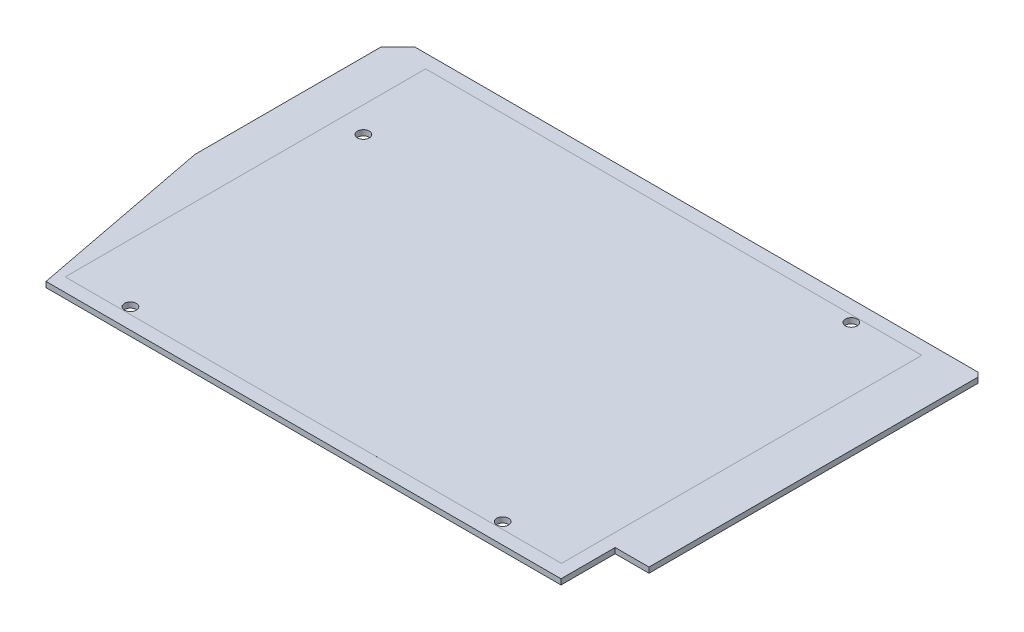
ISO-10303-21;
HEADER;
FILE_DESCRIPTION(('STEP AP214'),'2;1');
FILE_NAME('part.step','',(''),(''),'','','');
FILE_SCHEMA(('AUTOMOTIVE_DESIGN { 1 0 10303 214 1 1 1 1 }'));
ENDSEC;
DATA;
#1=APPLICATION_CONTEXT('core data for automotive mechanical design processes');
#2=APPLICATION_PROTOCOL_DEFINITION('international standard','automotive_design',2000,#1);
#3=PRODUCT_CONTEXT('',#1,'mechanical');
#4=PRODUCT('Part','Part','',(#3));
#5=PRODUCT_RELATED_PRODUCT_CATEGORY('part','',(#4));
#6=PRODUCT_DEFINITION_FORMATION('','',#4);
#7=PRODUCT_DEFINITION_CONTEXT('part definition',#1,'design');
#8=PRODUCT_DEFINITION('design','',#6,#7);
#9=PRODUCT_DEFINITION_SHAPE('','',#8);
#10=(LENGTH_UNIT() NAMED_UNIT(*) SI_UNIT(.MILLI.,.METRE.));
#11=(NAMED_UNIT(*) PLANE_ANGLE_UNIT() SI_UNIT($,.RADIAN.));
#12=(NAMED_UNIT(*) SI_UNIT($,.STERADIAN.) SOLID_ANGLE_UNIT());
#13=UNCERTAINTY_MEASURE_WITH_UNIT(LENGTH_MEASURE(1.E-05),#10,'distance_accuracy_value','');
#14=(GEOMETRIC_REPRESENTATION_CONTEXT(3) GLOBAL_UNCERTAINTY_ASSIGNED_CONTEXT((#13)) GLOBAL_UNIT_ASSIGNED_CONTEXT((#10,
#11,#12)) REPRESENTATION_CONTEXT('',''));
#15=CARTESIAN_POINT('',(0.,0.,0.));
#16=DIRECTION('',(0.,0.,1.));
#17=DIRECTION('',(1.,0.,0.));
#18=AXIS2_PLACEMENT_3D('',#15,#16,#17);
#19=CARTESIAN_POINT('',(-86.35,1.6,-57.25));
#20=DIRECTION('',(1.,0.,0.));
#21=DIRECTION('',(0.,0.,-1.));
#22=AXIS2_PLACEMENT_3D('',#19,#20,#21);
#23=PLANE('',#22);
#24=DIRECTION('',(0.,-1.,0.));
#25=VECTOR('',#24,1.);
#26=CARTESIAN_POINT('',(-86.35,260.619007033724,2.74999999999997));
#27=LINE('',#26,#25);
#28=CARTESIAN_POINT('',(-86.35,1.59989999999999,2.74999999999997));
#29=VERTEX_POINT('',#28);
#30=CARTESIAN_POINT('',(-86.35,0.,2.74999999999997));
#31=VERTEX_POINT('',#30);
#32=EDGE_CURVE('E207',#29,#31,#27,.T.);
#33=ORIENTED_EDGE('',*,*,#32,.F.);
#34=DIRECTION('',(0.,0.,1.));
#35=VECTOR('',#34,1.);
#36=CARTESIAN_POINT('',(-86.35,1.5999,-57.25));
#37=LINE('',#36,#35);
#38=CARTESIAN_POINT('',(-86.35,1.5999,-52.25));
#39=VERTEX_POINT('',#38);
#40=EDGE_CURVE('E182',#39,#29,#37,.T.);
#41=ORIENTED_EDGE('',*,*,#40,.F.);
#42=DIRECTION('',(0.,-1.,0.));
#43=VECTOR('',#42,1.);
#44=CARTESIAN_POINT('',(-86.35,1.6,-52.25));
#45=LINE('',#44,#43);
#46=CARTESIAN_POINT('',(-86.35,0.,-52.25));
#47=VERTEX_POINT('',#46);
#48=EDGE_CURVE('E151',#39,#47,#45,.T.);
#49=ORIENTED_EDGE('',*,*,#48,.T.);
#50=DIRECTION('',(0.,0.,1.));
#51=VECTOR('',#50,1.);
#52=CARTESIAN_POINT('',(-86.35,0.,-57.25));
#53=LINE('',#52,#51);
#54=EDGE_CURVE('E152',#47,#31,#53,.T.);
#55=ORIENTED_EDGE('',*,*,#54,.T.);
#56=EDGE_LOOP('',(#33,#41,#49,#55));
#57=FACE_BOUND('',#56,.T.);
#58=ADVANCED_FACE('F36',(#57),#23,.F.);
#59=CARTESIAN_POINT('',(-86.35,1.6,57.25));
#60=DIRECTION('',(0.,0.,-1.));
#61=DIRECTION('',(-1.,0.,0.));
#62=AXIS2_PLACEMENT_3D('',#59,#60,#61);
#63=PLANE('',#62);
#64=DIRECTION('',(1.,0.,0.));
#65=VECTOR('',#64,1.);
#66=CARTESIAN_POINT('',(-86.35,0.,57.25));
#67=LINE('',#66,#65);
#68=CARTESIAN_POINT('',(-75.85,0.,57.25));
#69=VERTEX_POINT('',#68);
#70=CARTESIAN_POINT('',(76.35,0.,57.25));
#71=VERTEX_POINT('',#70);
#72=EDGE_CURVE('E147',#69,#71,#67,.T.);
#73=ORIENTED_EDGE('',*,*,#72,.T.);
#74=DIRECTION('',(0.,1.,0.));
#75=VECTOR('',#74,1.);
#76=CARTESIAN_POINT('',(76.35,-8.4,57.25));
#77=LINE('',#76,#75);
#78=CARTESIAN_POINT('',(76.35,1.5999,57.25));
#79=VERTEX_POINT('',#78);
#80=EDGE_CURVE('E130',#71,#79,#77,.T.);
#81=ORIENTED_EDGE('',*,*,#80,.T.);
#82=DIRECTION('',(1.,0.,0.));
#83=VECTOR('',#82,1.);
#84=CARTESIAN_POINT('',(-86.35,1.5999,57.25));
#85=LINE('',#84,#83);
#86=CARTESIAN_POINT('',(-75.85,1.5999,57.25));
#87=VERTEX_POINT('',#86);
#88=EDGE_CURVE('E180',#87,#79,#85,.T.);
#89=ORIENTED_EDGE('',*,*,#88,.F.);
#90=DIRECTION('',(0.,-1.,0.));
#91=VECTOR('',#90,1.);
#92=CARTESIAN_POINT('',(-75.85,260.619007033724,57.25));
#93=LINE('',#92,#91);
#94=EDGE_CURVE('E59',#87,#69,#93,.T.);
#95=ORIENTED_EDGE('',*,*,#94,.T.);
#96=EDGE_LOOP('',(#73,#81,#89,#95));
#97=FACE_BOUND('',#96,.T.);
#98=ADVANCED_FACE('F150',(#97),#63,.F.);
#99=CARTESIAN_POINT('',(86.35,0.,57.25));
#100=DIRECTION('',(0.,1.,0.));
#101=DIRECTION('',(0.,0.,1.));
#102=AXIS2_PLACEMENT_3D('',#99,#100,#101);
#103=PLANE('',#102);
#104=CARTESIAN_POINT('',(-56.898,0.,51.25));
#105=DIRECTION('',(0.,1.,0.));
#106=DIRECTION('',(0.,0.,1.));
#107=AXIS2_PLACEMENT_3D('',#104,#105,#106);
#108=CIRCLE('',#107,1.75);
#109=CARTESIAN_POINT('',(-56.898,0.,53.));
#110=VERTEX_POINT('',#109);
#111=EDGE_CURVE('E317',#110,#110,#108,.F.);
#112=ORIENTED_EDGE('',*,*,#111,.F.);
#113=EDGE_LOOP('',(#112));
#114=FACE_BOUND('',#113,.T.);
#115=CARTESIAN_POINT('',(53.102,0.,51.25));
#116=DIRECTION('',(0.,1.,0.));
#117=DIRECTION('',(0.,0.,1.));
#118=AXIS2_PLACEMENT_3D('',#115,#116,#117);
#119=CIRCLE('',#118,1.75);
#120=CARTESIAN_POINT('',(53.102,0.,53.));
#121=VERTEX_POINT('',#120);
#122=EDGE_CURVE('E321',#121,#121,#119,.F.);
#123=ORIENTED_EDGE('',*,*,#122,.F.);
#124=EDGE_LOOP('',(#123));
#125=FACE_BOUND('',#124,.T.);
#126=CARTESIAN_POINT('',(53.65,0.,-51.25));
#127=DIRECTION('',(0.,1.,0.));
#128=DIRECTION('',(0.,0.,1.));
#129=AXIS2_PLACEMENT_3D('',#126,#127,#128);
#130=CIRCLE('',#129,1.75);
#131=CARTESIAN_POINT('',(53.65,0.,-49.5));
#132=VERTEX_POINT('',#131);
#133=EDGE_CURVE('E325',#132,#132,#130,.F.);
#134=ORIENTED_EDGE('',*,*,#133,.F.);
#135=EDGE_LOOP('',(#134));
#136=FACE_BOUND('',#135,.T.);
#137=CARTESIAN_POINT('',(-66.55,0.,-27.25));
#138=DIRECTION('',(0.,1.,0.));
#139=DIRECTION('',(0.,0.,1.));
#140=AXIS2_PLACEMENT_3D('',#137,#138,#139);
#141=CIRCLE('',#140,1.75);
#142=CARTESIAN_POINT('',(-66.55,0.,-25.5));
#143=VERTEX_POINT('',#142);
#144=EDGE_CURVE('E141',#143,#143,#141,.F.);
#145=ORIENTED_EDGE('',*,*,#144,.F.);
#146=EDGE_LOOP('',(#145));
#147=FACE_BOUND('',#146,.T.);
#148=DIRECTION('',(-1.,0.,0.));
#149=VECTOR('',#148,1.);
#150=CARTESIAN_POINT('',(86.35,0.,41.25));
#151=LINE('',#150,#149);
#152=CARTESIAN_POINT('',(86.35,0.,41.25));
#153=VERTEX_POINT('',#152);
#154=CARTESIAN_POINT('',(76.35,0.,41.25));
#155=VERTEX_POINT('',#154);
#156=EDGE_CURVE('E51',#153,#155,#151,.T.);
#157=ORIENTED_EDGE('',*,*,#156,.T.);
#158=DIRECTION('',(0.,0.,1.));
#159=VECTOR('',#158,1.);
#160=CARTESIAN_POINT('',(76.35,0.,57.25));
#161=LINE('',#160,#159);
#162=EDGE_CURVE('E134',#155,#71,#161,.T.);
#163=ORIENTED_EDGE('',*,*,#162,.T.);
#164=ORIENTED_EDGE('',*,*,#72,.F.);
#165=DIRECTION('',(0.189181512146997,0.,0.98194213447727));
#166=VECTOR('',#165,1.);
#167=CARTESIAN_POINT('',(-70.0449196559,0.,87.3811313098523));
#168=LINE('',#167,#166);
#169=EDGE_CURVE('E208',#31,#69,#168,.T.);
#170=ORIENTED_EDGE('',*,*,#169,.F.);
#171=ORIENTED_EDGE('',*,*,#54,.F.);
#172=DIRECTION('',(-0.707106781186548,0.,0.707106781186548));
#173=VECTOR('',#172,1.);
#174=CARTESIAN_POINT('',(-86.35,0.,-52.25));
#175=LINE('',#174,#173);
#176=CARTESIAN_POINT('',(-81.35,0.,-57.25));
#177=VERTEX_POINT('',#176);
#178=EDGE_CURVE('E154',#47,#177,#175,.F.);
#179=ORIENTED_EDGE('',*,*,#178,.T.);
#180=DIRECTION('',(-1.,0.,0.));
#181=VECTOR('',#180,1.);
#182=CARTESIAN_POINT('',(-86.35,0.,-57.25));
#183=LINE('',#182,#181);
#184=CARTESIAN_POINT('',(85.08,0.,-57.25));
#185=VERTEX_POINT('',#184);
#186=EDGE_CURVE('E157',#185,#177,#183,.T.);
#187=ORIENTED_EDGE('',*,*,#186,.F.);
#188=DIRECTION('',(-0.707106781186548,0.,-0.707106781186548));
#189=VECTOR('',#188,1.);
#190=CARTESIAN_POINT('',(85.08,0.,-57.25));
#191=LINE('',#190,#189);
#192=CARTESIAN_POINT('',(86.35,0.,-55.98));
#193=VERTEX_POINT('',#192);
#194=EDGE_CURVE('E169',#185,#193,#191,.F.);
#195=ORIENTED_EDGE('',*,*,#194,.T.);
#196=DIRECTION('',(0.,0.,-1.));
#197=VECTOR('',#196,1.);
#198=CARTESIAN_POINT('',(86.35,0.,-57.25));
#199=LINE('',#198,#197);
#200=EDGE_CURVE('E186',#153,#193,#199,.T.);
#201=ORIENTED_EDGE('',*,*,#200,.F.);
#202=EDGE_LOOP('',(#157,#163,#164,#170,#171,#179,#187,#195,#201));
#203=FACE_BOUND('',#202,.T.);
#204=ADVANCED_FACE('F145',(#114,#125,#136,#147,#203),#103,.F.);
#205=CARTESIAN_POINT('',(0.,1.5999,0.));
#206=DIRECTION('',(0.,1.,0.));
#207=DIRECTION('',(0.,0.,1.));
#208=AXIS2_PLACEMENT_3D('',#205,#206,#207);
#209=PLANE('',#208);
#210=DIRECTION('',(0.,0.,1.));
#211=VECTOR('',#210,1.);
#212=CARTESIAN_POINT('',(76.3500000000001,1.5999,0.));
#213=LINE('',#212,#211);
#214=CARTESIAN_POINT('',(76.35,1.5999,41.25));
#215=VERTEX_POINT('',#214);
#216=EDGE_CURVE('E13',#215,#79,#213,.T.);
#217=ORIENTED_EDGE('',*,*,#216,.F.);
#218=DIRECTION('',(-1.,0.,0.));
#219=VECTOR('',#218,1.);
#220=CARTESIAN_POINT('',(0.,1.5999,41.25));
#221=LINE('',#220,#219);
#222=CARTESIAN_POINT('',(86.35,1.5999,41.25));
#223=VERTEX_POINT('',#222);
#224=EDGE_CURVE('E249',#223,#215,#221,.T.);
#225=ORIENTED_EDGE('',*,*,#224,.F.);
#226=DIRECTION('',(0.,0.,-1.));
#227=VECTOR('',#226,1.);
#228=CARTESIAN_POINT('',(86.35,1.5999,-57.25));
#229=LINE('',#228,#227);
#230=CARTESIAN_POINT('',(86.35,1.5999,-55.98));
#231=VERTEX_POINT('',#230);
#232=EDGE_CURVE('E189',#223,#231,#229,.T.);
#233=ORIENTED_EDGE('',*,*,#232,.T.);
#234=DIRECTION('',(-0.707106781186548,0.,-0.707106781186548));
#235=VECTOR('',#234,1.);
#236=CARTESIAN_POINT('',(85.08,1.5999,-57.25));
#237=LINE('',#236,#235);
#238=CARTESIAN_POINT('',(85.08,1.5999,-57.25));
#239=VERTEX_POINT('',#238);
#240=EDGE_CURVE('E174',#239,#231,#237,.F.);
#241=ORIENTED_EDGE('',*,*,#240,.F.);
#242=DIRECTION('',(-1.,0.,0.));
#243=VECTOR('',#242,1.);
#244=CARTESIAN_POINT('',(-86.35,1.5999,-57.25));
#245=LINE('',#244,#243);
#246=CARTESIAN_POINT('',(-81.35,1.5999,-57.25));
#247=VERTEX_POINT('',#246);
#248=EDGE_CURVE('E205',#239,#247,#245,.T.);
#249=ORIENTED_EDGE('',*,*,#248,.T.);
#250=DIRECTION('',(-0.707106781186548,0.,0.707106781186548));
#251=VECTOR('',#250,1.);
#252=CARTESIAN_POINT('',(-86.35,1.5999,-52.25));
#253=LINE('',#252,#251);
#254=EDGE_CURVE('E184',#39,#247,#253,.F.);
#255=ORIENTED_EDGE('',*,*,#254,.F.);
#256=ORIENTED_EDGE('',*,*,#40,.T.);
#257=DIRECTION('',(0.189181512146997,0.,0.981942134477269));
#258=VECTOR('',#257,1.);
#259=CARTESIAN_POINT('',(-83.7704187631878,1.5999,16.1392549910729));
#260=LINE('',#259,#258);
#261=EDGE_CURVE('E44',#29,#87,#260,.T.);
#262=ORIENTED_EDGE('',*,*,#261,.T.);
#263=ORIENTED_EDGE('',*,*,#88,.T.);
#264=EDGE_LOOP('',(#217,#225,#233,#241,#249,#255,#256,#262,#263));
#265=FACE_BOUND('',#264,.T.);
#266=DIRECTION('',(1.,0.,0.));
#267=VECTOR('',#266,1.);
#268=CARTESIAN_POINT('',(72.4805203195644,1.5999,53.25));
#269=LINE('',#268,#267);
#270=CARTESIAN_POINT('',(-74.1649344505304,1.5999,53.25));
#271=VERTEX_POINT('',#270);
#272=CARTESIAN_POINT('',(72.4805203195644,1.5999,53.25));
#273=VERTEX_POINT('',#272);
#274=EDGE_CURVE('E225',#271,#273,#269,.T.);
#275=ORIENTED_EDGE('',*,*,#274,.F.);
#276=DIRECTION('',(0.,0.,1.));
#277=VECTOR('',#276,1.);
#278=CARTESIAN_POINT('',(-74.1649344505304,1.5999,53.25));
#279=LINE('',#278,#277);
#280=CARTESIAN_POINT('',(-74.1649344505304,1.5999,-53.25));
#281=VERTEX_POINT('',#280);
#282=EDGE_CURVE('E222',#281,#271,#279,.T.);
#283=ORIENTED_EDGE('',*,*,#282,.F.);
#284=DIRECTION('',(-1.,0.,0.));
#285=VECTOR('',#284,1.);
#286=CARTESIAN_POINT('',(72.4805203195644,1.5999,-53.25));
#287=LINE('',#286,#285);
#288=CARTESIAN_POINT('',(72.4805203195644,1.5999,-53.25));
#289=VERTEX_POINT('',#288);
#290=EDGE_CURVE('E218',#289,#281,#287,.T.);
#291=ORIENTED_EDGE('',*,*,#290,.F.);
#292=DIRECTION('',(0.,0.,-1.));
#293=VECTOR('',#292,1.);
#294=CARTESIAN_POINT('',(72.4805203195644,1.5999,53.25));
#295=LINE('',#294,#293);
#296=EDGE_CURVE('E215',#273,#289,#295,.T.);
#297=ORIENTED_EDGE('',*,*,#296,.F.);
#298=EDGE_LOOP('',(#275,#283,#291,#297));
#299=FACE_BOUND('',#298,.T.);
#300=ADVANCED_FACE('F178',(#265,#299),#209,.T.);
#301=CARTESIAN_POINT('',(86.35,1.6,-57.25));
#302=DIRECTION('',(-1.,0.,0.));
#303=DIRECTION('',(0.,0.,1.));
#304=AXIS2_PLACEMENT_3D('',#301,#302,#303);
#305=PLANE('',#304);
#306=ORIENTED_EDGE('',*,*,#232,.F.);
#307=DIRECTION('',(0.,1.,0.));
#308=VECTOR('',#307,1.);
#309=CARTESIAN_POINT('',(86.35,-8.4,41.25));
#310=LINE('',#309,#308);
#311=EDGE_CURVE('E140',#153,#223,#310,.T.);
#312=ORIENTED_EDGE('',*,*,#311,.F.);
#313=ORIENTED_EDGE('',*,*,#200,.T.);
#314=DIRECTION('',(0.,1.,0.));
#315=VECTOR('',#314,1.);
#316=CARTESIAN_POINT('',(86.35,1.6,-55.98));
#317=LINE('',#316,#315);
#318=EDGE_CURVE('E166',#193,#231,#317,.T.);
#319=ORIENTED_EDGE('',*,*,#318,.T.);
#320=EDGE_LOOP('',(#306,#312,#313,#319));
#321=FACE_BOUND('',#320,.T.);
#322=ADVANCED_FACE('F253',(#321),#305,.F.);
#323=CARTESIAN_POINT('',(-86.35,1.6,-57.25));
#324=DIRECTION('',(0.,0.,1.));
#325=DIRECTION('',(1.,0.,0.));
#326=AXIS2_PLACEMENT_3D('',#323,#324,#325);
#327=PLANE('',#326);
#328=ORIENTED_EDGE('',*,*,#248,.F.);
#329=DIRECTION('',(0.,-1.,0.));
#330=VECTOR('',#329,1.);
#331=CARTESIAN_POINT('',(85.08,1.6,-57.25));
#332=LINE('',#331,#330);
#333=EDGE_CURVE('E172',#239,#185,#332,.T.);
#334=ORIENTED_EDGE('',*,*,#333,.T.);
#335=ORIENTED_EDGE('',*,*,#186,.T.);
#336=DIRECTION('',(0.,1.,0.));
#337=VECTOR('',#336,1.);
#338=CARTESIAN_POINT('',(-81.35,1.6,-57.25));
#339=LINE('',#338,#337);
#340=EDGE_CURVE('E163',#177,#247,#339,.T.);
#341=ORIENTED_EDGE('',*,*,#340,.T.);
#342=EDGE_LOOP('',(#328,#334,#335,#341));
#343=FACE_BOUND('',#342,.T.);
#344=ADVANCED_FACE('F196',(#343),#327,.F.);
#345=CARTESIAN_POINT('',(-86.35,1.6,-52.25));
#346=DIRECTION('',(0.707106781186548,0.,0.707106781186548));
#347=DIRECTION('',(0.707106781186548,0.,-0.707106781186548));
#348=AXIS2_PLACEMENT_3D('',#345,#346,#347);
#349=PLANE('',#348);
#350=ORIENTED_EDGE('',*,*,#48,.F.);
#351=ORIENTED_EDGE('',*,*,#254,.T.);
#352=ORIENTED_EDGE('',*,*,#340,.F.);
#353=ORIENTED_EDGE('',*,*,#178,.F.);
#354=EDGE_LOOP('',(#350,#351,#352,#353));
#355=FACE_BOUND('',#354,.T.);
#356=ADVANCED_FACE('F204',(#355),#349,.F.);
#357=CARTESIAN_POINT('',(85.08,1.6,-57.25));
#358=DIRECTION('',(-0.707106781186548,0.,0.707106781186548));
#359=DIRECTION('',(0.707106781186548,0.,0.707106781186548));
#360=AXIS2_PLACEMENT_3D('',#357,#358,#359);
#361=PLANE('',#360);
#362=ORIENTED_EDGE('',*,*,#333,.F.);
#363=ORIENTED_EDGE('',*,*,#240,.T.);
#364=ORIENTED_EDGE('',*,*,#318,.F.);
#365=ORIENTED_EDGE('',*,*,#194,.F.);
#366=EDGE_LOOP('',(#362,#363,#364,#365));
#367=FACE_BOUND('',#366,.T.);
#368=ADVANCED_FACE('F38',(#367),#361,.F.);
#369=CARTESIAN_POINT('',(72.4805203195644,1.5999,53.25));
#370=DIRECTION('',(1.,0.,0.));
#371=DIRECTION('',(0.,0.,-1.));
#372=AXIS2_PLACEMENT_3D('',#369,#370,#371);
#373=PLANE('',#372);
#374=DIRECTION('',(0.,0.,-1.));
#375=VECTOR('',#374,1.);
#376=CARTESIAN_POINT('',(72.4805203195644,1.6,53.25));
#377=LINE('',#376,#375);
#378=CARTESIAN_POINT('',(72.4805203195644,1.6,53.25));
#379=VERTEX_POINT('',#378);
#380=CARTESIAN_POINT('',(72.4805203195644,1.6,-53.25));
#381=VERTEX_POINT('',#380);
#382=EDGE_CURVE('E210',#379,#381,#377,.T.);
#383=ORIENTED_EDGE('',*,*,#382,.F.);
#384=DIRECTION('',(0.,1.,0.));
#385=VECTOR('',#384,1.);
#386=CARTESIAN_POINT('',(72.4805203195644,1.5999,53.25));
#387=LINE('',#386,#385);
#388=EDGE_CURVE('E239',#273,#379,#387,.T.);
#389=ORIENTED_EDGE('',*,*,#388,.F.);
#390=ORIENTED_EDGE('',*,*,#296,.T.);
#391=DIRECTION('',(0.,1.,0.));
#392=VECTOR('',#391,1.);
#393=CARTESIAN_POINT('',(72.4805203195644,1.5999,-53.25));
#394=LINE('',#393,#392);
#395=EDGE_CURVE('E228',#289,#381,#394,.T.);
#396=ORIENTED_EDGE('',*,*,#395,.T.);
#397=EDGE_LOOP('',(#383,#389,#390,#396));
#398=FACE_BOUND('',#397,.T.);
#399=ADVANCED_FACE('F287',(#398),#373,.T.);
#400=CARTESIAN_POINT('',(72.4805203195644,1.5999,53.25));
#401=DIRECTION('',(0.,0.,1.));
#402=DIRECTION('',(1.,0.,0.));
#403=AXIS2_PLACEMENT_3D('',#400,#401,#402);
#404=PLANE('',#403);
#405=DIRECTION('',(1.,0.,0.));
#406=VECTOR('',#405,1.);
#407=CARTESIAN_POINT('',(72.4805203195644,1.6,53.25));
#408=LINE('',#407,#406);
#409=CARTESIAN_POINT('',(-74.1649344505304,1.6,53.25));
#410=VERTEX_POINT('',#409);
#411=EDGE_CURVE('E219',#410,#379,#408,.T.);
#412=ORIENTED_EDGE('',*,*,#411,.F.);
#413=DIRECTION('',(0.,1.,0.));
#414=VECTOR('',#413,1.);
#415=CARTESIAN_POINT('',(-74.1649344505304,1.5999,53.25));
#416=LINE('',#415,#414);
#417=EDGE_CURVE('E241',#271,#410,#416,.T.);
#418=ORIENTED_EDGE('',*,*,#417,.F.);
#419=ORIENTED_EDGE('',*,*,#274,.T.);
#420=ORIENTED_EDGE('',*,*,#388,.T.);
#421=EDGE_LOOP('',(#412,#418,#419,#420));
#422=FACE_BOUND('',#421,.T.);
#423=ADVANCED_FACE('F291',(#422),#404,.T.);
#424=CARTESIAN_POINT('',(-74.1649344505304,1.5999,53.25));
#425=DIRECTION('',(-1.,0.,0.));
#426=DIRECTION('',(0.,0.,1.));
#427=AXIS2_PLACEMENT_3D('',#424,#425,#426);
#428=PLANE('',#427);
#429=DIRECTION('',(0.,0.,1.));
#430=VECTOR('',#429,1.);
#431=CARTESIAN_POINT('',(-74.1649344505304,1.6,53.25));
#432=LINE('',#431,#430);
#433=CARTESIAN_POINT('',(-74.1649344505304,1.6,-53.25));
#434=VERTEX_POINT('',#433);
#435=EDGE_CURVE('E234',#434,#410,#432,.T.);
#436=ORIENTED_EDGE('',*,*,#435,.F.);
#437=DIRECTION('',(0.,1.,0.));
#438=VECTOR('',#437,1.);
#439=CARTESIAN_POINT('',(-74.1649344505304,1.5999,-53.25));
#440=LINE('',#439,#438);
#441=EDGE_CURVE('E243',#281,#434,#440,.T.);
#442=ORIENTED_EDGE('',*,*,#441,.F.);
#443=ORIENTED_EDGE('',*,*,#282,.T.);
#444=ORIENTED_EDGE('',*,*,#417,.T.);
#445=EDGE_LOOP('',(#436,#442,#443,#444));
#446=FACE_BOUND('',#445,.T.);
#447=ADVANCED_FACE('F297',(#446),#428,.T.);
#448=CARTESIAN_POINT('',(72.4805203195644,1.5999,-53.25));
#449=DIRECTION('',(0.,0.,-1.));
#450=DIRECTION('',(-1.,0.,0.));
#451=AXIS2_PLACEMENT_3D('',#448,#449,#450);
#452=PLANE('',#451);
#453=DIRECTION('',(-1.,0.,0.));
#454=VECTOR('',#453,1.);
#455=CARTESIAN_POINT('',(72.4805203195644,1.6,-53.25));
#456=LINE('',#455,#454);
#457=EDGE_CURVE('E231',#381,#434,#456,.T.);
#458=ORIENTED_EDGE('',*,*,#457,.F.);
#459=ORIENTED_EDGE('',*,*,#395,.F.);
#460=ORIENTED_EDGE('',*,*,#290,.T.);
#461=ORIENTED_EDGE('',*,*,#441,.T.);
#462=EDGE_LOOP('',(#458,#459,#460,#461));
#463=FACE_BOUND('',#462,.T.);
#464=ADVANCED_FACE('F303',(#463),#452,.T.);
#465=CARTESIAN_POINT('',(86.35,1.6,57.25));
#466=DIRECTION('',(0.,1.,0.));
#467=DIRECTION('',(0.,0.,1.));
#468=AXIS2_PLACEMENT_3D('',#465,#466,#467);
#469=PLANE('',#468);
#470=CARTESIAN_POINT('',(-56.898,1.6,51.25));
#471=DIRECTION('',(0.,1.,0.));
#472=DIRECTION('',(0.,0.,1.));
#473=AXIS2_PLACEMENT_3D('',#470,#471,#472);
#474=CIRCLE('',#473,1.75);
#475=CARTESIAN_POINT('',(-56.898,1.6,53.));
#476=VERTEX_POINT('',#475);
#477=EDGE_CURVE('E342',#476,#476,#474,.T.);
#478=ORIENTED_EDGE('',*,*,#477,.F.);
#479=EDGE_LOOP('',(#478));
#480=FACE_BOUND('',#479,.T.);
#481=CARTESIAN_POINT('',(53.102,1.6,51.25));
#482=DIRECTION('',(0.,1.,0.));
#483=DIRECTION('',(0.,0.,1.));
#484=AXIS2_PLACEMENT_3D('',#481,#482,#483);
#485=CIRCLE('',#484,1.75);
#486=CARTESIAN_POINT('',(53.102,1.6,53.));
#487=VERTEX_POINT('',#486);
#488=EDGE_CURVE('E338',#487,#487,#485,.T.);
#489=ORIENTED_EDGE('',*,*,#488,.F.);
#490=EDGE_LOOP('',(#489));
#491=FACE_BOUND('',#490,.T.);
#492=CARTESIAN_POINT('',(53.65,1.6,-51.25));
#493=DIRECTION('',(0.,1.,0.));
#494=DIRECTION('',(0.,0.,1.));
#495=AXIS2_PLACEMENT_3D('',#492,#493,#494);
#496=CIRCLE('',#495,1.75);
#497=CARTESIAN_POINT('',(53.65,1.6,-49.5));
#498=VERTEX_POINT('',#497);
#499=EDGE_CURVE('E334',#498,#498,#496,.T.);
#500=ORIENTED_EDGE('',*,*,#499,.F.);
#501=EDGE_LOOP('',(#500));
#502=FACE_BOUND('',#501,.T.);
#503=CARTESIAN_POINT('',(-66.55,1.6,-27.25));
#504=DIRECTION('',(0.,1.,0.));
#505=DIRECTION('',(0.,0.,1.));
#506=AXIS2_PLACEMENT_3D('',#503,#504,#505);
#507=CIRCLE('',#506,1.75);
#508=CARTESIAN_POINT('',(-66.55,1.6,-25.5));
#509=VERTEX_POINT('',#508);
#510=EDGE_CURVE('E329',#509,#509,#507,.T.);
#511=ORIENTED_EDGE('',*,*,#510,.F.);
#512=EDGE_LOOP('',(#511));
#513=FACE_BOUND('',#512,.T.);
#514=ORIENTED_EDGE('',*,*,#411,.T.);
#515=ORIENTED_EDGE('',*,*,#382,.T.);
#516=ORIENTED_EDGE('',*,*,#457,.T.);
#517=ORIENTED_EDGE('',*,*,#435,.T.);
#518=EDGE_LOOP('',(#514,#515,#516,#517));
#519=FACE_BOUND('',#518,.T.);
#520=ADVANCED_FACE('F307',(#480,#491,#502,#513,#519),#469,.T.);
#521=CARTESIAN_POINT('',(-75.85,260.619007033724,57.25));
#522=DIRECTION('',(-0.981942134477269,0.,0.189181512146997));
#523=DIRECTION('',(0.189181512146997,0.,0.98194213447727));
#524=AXIS2_PLACEMENT_3D('',#521,#522,#523);
#525=PLANE('',#524);
#526=ORIENTED_EDGE('',*,*,#32,.T.);
#527=ORIENTED_EDGE('',*,*,#169,.T.);
#528=ORIENTED_EDGE('',*,*,#94,.F.);
#529=ORIENTED_EDGE('',*,*,#261,.F.);
#530=EDGE_LOOP('',(#526,#527,#528,#529));
#531=FACE_BOUND('',#530,.T.);
#532=ADVANCED_FACE('F270',(#531),#525,.T.);
#533=CARTESIAN_POINT('',(76.35,-8.4,57.25));
#534=DIRECTION('',(-1.,0.,0.));
#535=DIRECTION('',(0.,0.,1.));
#536=AXIS2_PLACEMENT_3D('',#533,#534,#535);
#537=PLANE('',#536);
#538=DIRECTION('',(0.,1.,0.));
#539=VECTOR('',#538,1.);
#540=CARTESIAN_POINT('',(76.35,-8.4,41.25));
#541=LINE('',#540,#539);
#542=EDGE_CURVE('E254',#155,#215,#541,.T.);
#543=ORIENTED_EDGE('',*,*,#542,.T.);
#544=ORIENTED_EDGE('',*,*,#216,.T.);
#545=ORIENTED_EDGE('',*,*,#80,.F.);
#546=ORIENTED_EDGE('',*,*,#162,.F.);
#547=EDGE_LOOP('',(#543,#544,#545,#546));
#548=FACE_BOUND('',#547,.T.);
#549=ADVANCED_FACE('F133',(#548),#537,.F.);
#550=CARTESIAN_POINT('',(76.35,-8.4,41.25));
#551=DIRECTION('',(0.,0.,-1.));
#552=DIRECTION('',(-1.,0.,0.));
#553=AXIS2_PLACEMENT_3D('',#550,#551,#552);
#554=PLANE('',#553);
#555=ORIENTED_EDGE('',*,*,#311,.T.);
#556=ORIENTED_EDGE('',*,*,#224,.T.);
#557=ORIENTED_EDGE('',*,*,#542,.F.);
#558=ORIENTED_EDGE('',*,*,#156,.F.);
#559=EDGE_LOOP('',(#555,#556,#557,#558));
#560=FACE_BOUND('',#559,.T.);
#561=ADVANCED_FACE('F259',(#560),#554,.F.);
#562=CARTESIAN_POINT('',(-66.55,-0.000999999999999916,-27.25));
#563=DIRECTION('',(0.,1.,0.));
#564=DIRECTION('',(0.,0.,1.));
#565=AXIS2_PLACEMENT_3D('',#562,#563,#564);
#566=CYLINDRICAL_SURFACE('',#565,1.75);
#567=ORIENTED_EDGE('',*,*,#510,.T.);
#568=EDGE_LOOP('',(#567));
#569=FACE_BOUND('',#568,.T.);
#570=ORIENTED_EDGE('',*,*,#144,.T.);
#571=EDGE_LOOP('',(#570));
#572=FACE_BOUND('',#571,.T.);
#573=ADVANCED_FACE('F261',(#569,#572),#566,.F.);
#574=CARTESIAN_POINT('',(53.65,-0.000999999999999916,-51.25));
#575=DIRECTION('',(0.,1.,0.));
#576=DIRECTION('',(0.,0.,1.));
#577=AXIS2_PLACEMENT_3D('',#574,#575,#576);
#578=CYLINDRICAL_SURFACE('',#577,1.75);
#579=ORIENTED_EDGE('',*,*,#499,.T.);
#580=EDGE_LOOP('',(#579));
#581=FACE_BOUND('',#580,.T.);
#582=ORIENTED_EDGE('',*,*,#133,.T.);
#583=EDGE_LOOP('',(#582));
#584=FACE_BOUND('',#583,.T.);
#585=ADVANCED_FACE('F267',(#581,#584),#578,.F.);
#586=CARTESIAN_POINT('',(53.102,-0.000999999999999916,51.25));
#587=DIRECTION('',(0.,1.,0.));
#588=DIRECTION('',(0.,0.,1.));
#589=AXIS2_PLACEMENT_3D('',#586,#587,#588);
#590=CYLINDRICAL_SURFACE('',#589,1.75);
#591=ORIENTED_EDGE('',*,*,#488,.T.);
#592=EDGE_LOOP('',(#591));
#593=FACE_BOUND('',#592,.T.);
#594=ORIENTED_EDGE('',*,*,#122,.T.);
#595=EDGE_LOOP('',(#594));
#596=FACE_BOUND('',#595,.T.);
#597=ADVANCED_FACE('F413',(#593,#596),#590,.F.);
#598=CARTESIAN_POINT('',(-56.898,-0.000999999999999916,51.25));
#599=DIRECTION('',(0.,1.,0.));
#600=DIRECTION('',(0.,0.,1.));
#601=AXIS2_PLACEMENT_3D('',#598,#599,#600);
#602=CYLINDRICAL_SURFACE('',#601,1.75);
#603=ORIENTED_EDGE('',*,*,#477,.T.);
#604=EDGE_LOOP('',(#603));
#605=FACE_BOUND('',#604,.T.);
#606=ORIENTED_EDGE('',*,*,#111,.T.);
#607=EDGE_LOOP('',(#606));
#608=FACE_BOUND('',#607,.T.);
#609=ADVANCED_FACE('F346',(#605,#608),#602,.F.);
#610=CLOSED_SHELL('',(#58,#98,#204,#300,#322,#344,#356,#368,#399,#423,#447,#464,#520,#532,#549,
#561,#573,#585,#597,#609));
#611=MANIFOLD_SOLID_BREP('B2',#610);
#612=ADVANCED_BREP_SHAPE_REPRESENTATION('',(#18,#611),#14);
#613=SHAPE_DEFINITION_REPRESENTATION(#9,#612);
ENDSEC;
END-ISO-10303-21;
